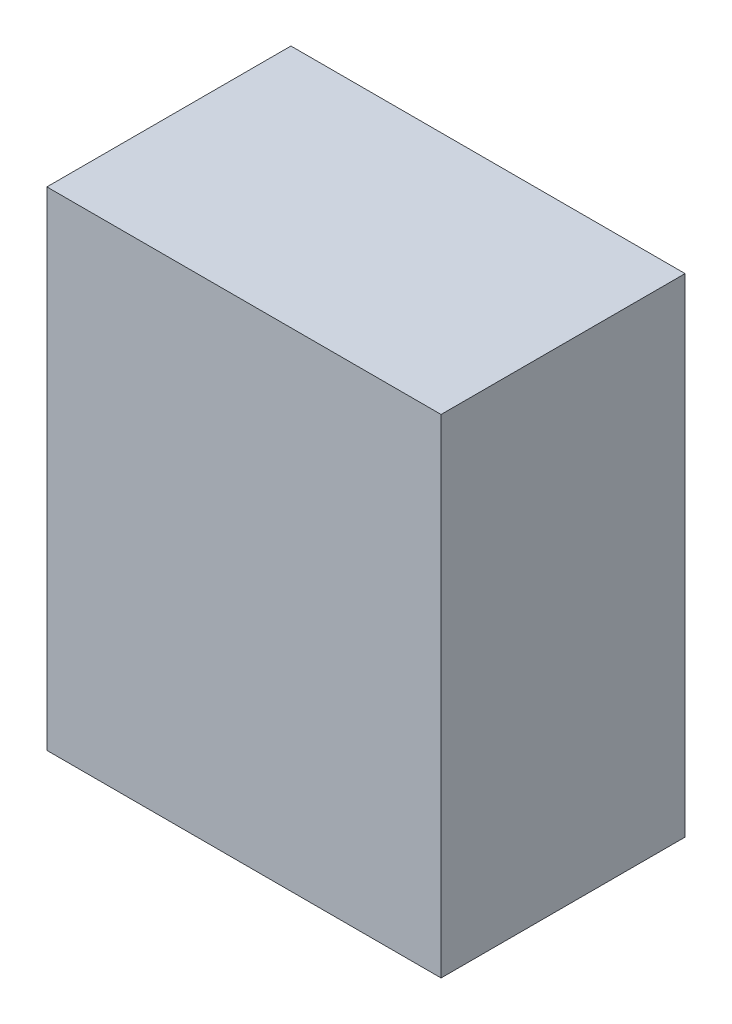
ISO-10303-21;
HEADER;
FILE_DESCRIPTION(('STEP AP214'),'2;1');
FILE_NAME('part.step','',(''),(''),'','','');
FILE_SCHEMA(('AUTOMOTIVE_DESIGN { 1 0 10303 214 1 1 1 1 }'));
ENDSEC;
DATA;
#1=APPLICATION_CONTEXT('core data for automotive mechanical design processes');
#2=APPLICATION_PROTOCOL_DEFINITION('international standard','automotive_design',2000,#1);
#3=PRODUCT_CONTEXT('',#1,'mechanical');
#4=PRODUCT('Part','Part','',(#3));
#5=PRODUCT_RELATED_PRODUCT_CATEGORY('part','',(#4));
#6=PRODUCT_DEFINITION_FORMATION('','',#4);
#7=PRODUCT_DEFINITION_CONTEXT('part definition',#1,'design');
#8=PRODUCT_DEFINITION('design','',#6,#7);
#9=PRODUCT_DEFINITION_SHAPE('','',#8);
#10=(LENGTH_UNIT() NAMED_UNIT(*) SI_UNIT(.MILLI.,.METRE.));
#11=(NAMED_UNIT(*) PLANE_ANGLE_UNIT() SI_UNIT($,.RADIAN.));
#12=(NAMED_UNIT(*) SI_UNIT($,.STERADIAN.) SOLID_ANGLE_UNIT());
#13=UNCERTAINTY_MEASURE_WITH_UNIT(LENGTH_MEASURE(1.E-05),#10,'distance_accuracy_value','');
#14=(GEOMETRIC_REPRESENTATION_CONTEXT(3) GLOBAL_UNCERTAINTY_ASSIGNED_CONTEXT((#13)) GLOBAL_UNIT_ASSIGNED_CONTEXT((#10,
#11,#12)) REPRESENTATION_CONTEXT('',''));
#15=CARTESIAN_POINT('',(0.,0.,0.));
#16=DIRECTION('',(0.,0.,1.));
#17=DIRECTION('',(1.,0.,0.));
#18=AXIS2_PLACEMENT_3D('',#15,#16,#17);
#19=CARTESIAN_POINT('',(0.,-52.,26.));
#20=DIRECTION('',(-1.,0.,0.));
#21=DIRECTION('',(0.,0.,1.));
#22=AXIS2_PLACEMENT_3D('',#19,#20,#21);
#23=PLANE('',#22);
#24=DIRECTION('',(0.,1.,0.));
#25=VECTOR('',#24,1.);
#26=CARTESIAN_POINT('',(0.,-52.,0.));
#27=LINE('',#26,#25);
#28=CARTESIAN_POINT('',(0.,-52.,0.));
#29=VERTEX_POINT('',#28);
#30=CARTESIAN_POINT('',(0.,0.,0.));
#31=VERTEX_POINT('',#30);
#32=EDGE_CURVE('E105',#29,#31,#27,.T.);
#33=ORIENTED_EDGE('',*,*,#32,.F.);
#34=DIRECTION('',(0.,0.,-1.));
#35=VECTOR('',#34,1.);
#36=CARTESIAN_POINT('',(0.,-52.,26.));
#37=LINE('',#36,#35);
#38=CARTESIAN_POINT('',(0.,-52.,26.));
#39=VERTEX_POINT('',#38);
#40=EDGE_CURVE('E11',#39,#29,#37,.T.);
#41=ORIENTED_EDGE('',*,*,#40,.F.);
#42=DIRECTION('',(0.,1.,0.));
#43=VECTOR('',#42,1.);
#44=CARTESIAN_POINT('',(0.,-52.,26.));
#45=LINE('',#44,#43);
#46=CARTESIAN_POINT('',(0.,0.,26.));
#47=VERTEX_POINT('',#46);
#48=EDGE_CURVE('E99',#39,#47,#45,.T.);
#49=ORIENTED_EDGE('',*,*,#48,.T.);
#50=DIRECTION('',(0.,0.,-1.));
#51=VECTOR('',#50,1.);
#52=CARTESIAN_POINT('',(0.,0.,26.));
#53=LINE('',#52,#51);
#54=EDGE_CURVE('E44',#47,#31,#53,.T.);
#55=ORIENTED_EDGE('',*,*,#54,.T.);
#56=EDGE_LOOP('',(#33,#41,#49,#55));
#57=FACE_BOUND('',#56,.T.);
#58=ADVANCED_FACE('F41',(#57),#23,.T.);
#59=CARTESIAN_POINT('',(42.,-52.,26.));
#60=DIRECTION('',(0.,-1.,0.));
#61=DIRECTION('',(0.,0.,-1.));
#62=AXIS2_PLACEMENT_3D('',#59,#60,#61);
#63=PLANE('',#62);
#64=DIRECTION('',(-1.,0.,0.));
#65=VECTOR('',#64,1.);
#66=CARTESIAN_POINT('',(42.,-52.,0.));
#67=LINE('',#66,#65);
#68=CARTESIAN_POINT('',(42.,-52.,0.));
#69=VERTEX_POINT('',#68);
#70=EDGE_CURVE('E101',#69,#29,#67,.T.);
#71=ORIENTED_EDGE('',*,*,#70,.F.);
#72=DIRECTION('',(0.,0.,-1.));
#73=VECTOR('',#72,1.);
#74=CARTESIAN_POINT('',(42.,-52.,26.));
#75=LINE('',#74,#73);
#76=CARTESIAN_POINT('',(42.,-52.,26.));
#77=VERTEX_POINT('',#76);
#78=EDGE_CURVE('E50',#77,#69,#75,.T.);
#79=ORIENTED_EDGE('',*,*,#78,.F.);
#80=DIRECTION('',(-1.,0.,0.));
#81=VECTOR('',#80,1.);
#82=CARTESIAN_POINT('',(42.,-52.,26.));
#83=LINE('',#82,#81);
#84=EDGE_CURVE('E96',#77,#39,#83,.T.);
#85=ORIENTED_EDGE('',*,*,#84,.T.);
#86=ORIENTED_EDGE('',*,*,#40,.T.);
#87=EDGE_LOOP('',(#71,#79,#85,#86));
#88=FACE_BOUND('',#87,.T.);
#89=ADVANCED_FACE('F115',(#88),#63,.T.);
#90=CARTESIAN_POINT('',(42.,0.,26.));
#91=DIRECTION('',(1.,0.,0.));
#92=DIRECTION('',(0.,0.,-1.));
#93=AXIS2_PLACEMENT_3D('',#90,#91,#92);
#94=PLANE('',#93);
#95=DIRECTION('',(0.,-1.,0.));
#96=VECTOR('',#95,1.);
#97=CARTESIAN_POINT('',(42.,0.,0.));
#98=LINE('',#97,#96);
#99=CARTESIAN_POINT('',(42.,0.,0.));
#100=VERTEX_POINT('',#99);
#101=EDGE_CURVE('E91',#100,#69,#98,.T.);
#102=ORIENTED_EDGE('',*,*,#101,.F.);
#103=DIRECTION('',(0.,0.,-1.));
#104=VECTOR('',#103,1.);
#105=CARTESIAN_POINT('',(42.,0.,26.));
#106=LINE('',#105,#104);
#107=CARTESIAN_POINT('',(42.,0.,26.));
#108=VERTEX_POINT('',#107);
#109=EDGE_CURVE('E86',#108,#100,#106,.T.);
#110=ORIENTED_EDGE('',*,*,#109,.F.);
#111=DIRECTION('',(0.,-1.,0.));
#112=VECTOR('',#111,1.);
#113=CARTESIAN_POINT('',(42.,0.,26.));
#114=LINE('',#113,#112);
#115=EDGE_CURVE('E89',#108,#77,#114,.T.);
#116=ORIENTED_EDGE('',*,*,#115,.T.);
#117=ORIENTED_EDGE('',*,*,#78,.T.);
#118=EDGE_LOOP('',(#102,#110,#116,#117));
#119=FACE_BOUND('',#118,.T.);
#120=ADVANCED_FACE('F88',(#119),#94,.T.);
#121=CARTESIAN_POINT('',(0.,0.,26.));
#122=DIRECTION('',(0.,1.,0.));
#123=DIRECTION('',(0.,0.,1.));
#124=AXIS2_PLACEMENT_3D('',#121,#122,#123);
#125=PLANE('',#124);
#126=DIRECTION('',(1.,0.,0.));
#127=VECTOR('',#126,1.);
#128=CARTESIAN_POINT('',(0.,0.,0.));
#129=LINE('',#128,#127);
#130=EDGE_CURVE('E108',#31,#100,#129,.T.);
#131=ORIENTED_EDGE('',*,*,#130,.F.);
#132=ORIENTED_EDGE('',*,*,#54,.F.);
#133=DIRECTION('',(1.,0.,0.));
#134=VECTOR('',#133,1.);
#135=CARTESIAN_POINT('',(0.,0.,26.));
#136=LINE('',#135,#134);
#137=EDGE_CURVE('E95',#47,#108,#136,.T.);
#138=ORIENTED_EDGE('',*,*,#137,.T.);
#139=ORIENTED_EDGE('',*,*,#109,.T.);
#140=EDGE_LOOP('',(#131,#132,#138,#139));
#141=FACE_BOUND('',#140,.T.);
#142=ADVANCED_FACE('F98',(#141),#125,.T.);
#143=CARTESIAN_POINT('',(0.,0.,26.));
#144=DIRECTION('',(0.,0.,-1.));
#145=DIRECTION('',(-1.,0.,0.));
#146=AXIS2_PLACEMENT_3D('',#143,#144,#145);
#147=PLANE('',#146);
#148=ORIENTED_EDGE('',*,*,#48,.F.);
#149=ORIENTED_EDGE('',*,*,#84,.F.);
#150=ORIENTED_EDGE('',*,*,#115,.F.);
#151=ORIENTED_EDGE('',*,*,#137,.F.);
#152=EDGE_LOOP('',(#148,#149,#150,#151));
#153=FACE_BOUND('',#152,.T.);
#154=ADVANCED_FACE('F94',(#153),#147,.F.);
#155=CARTESIAN_POINT('',(0.,0.,0.));
#156=DIRECTION('',(0.,0.,-1.));
#157=DIRECTION('',(-1.,0.,0.));
#158=AXIS2_PLACEMENT_3D('',#155,#156,#157);
#159=PLANE('',#158);
#160=ORIENTED_EDGE('',*,*,#32,.T.);
#161=ORIENTED_EDGE('',*,*,#130,.T.);
#162=ORIENTED_EDGE('',*,*,#101,.T.);
#163=ORIENTED_EDGE('',*,*,#70,.T.);
#164=EDGE_LOOP('',(#160,#161,#162,#163));
#165=FACE_BOUND('',#164,.T.);
#166=ADVANCED_FACE('F114',(#165),#159,.T.);
#167=CLOSED_SHELL('',(#58,#89,#120,#142,#154,#166));
#168=MANIFOLD_SOLID_BREP('B2',#167);
#169=ADVANCED_BREP_SHAPE_REPRESENTATION('',(#18,#168),#14);
#170=SHAPE_DEFINITION_REPRESENTATION(#9,#169);
ENDSEC;
END-ISO-10303-21;
